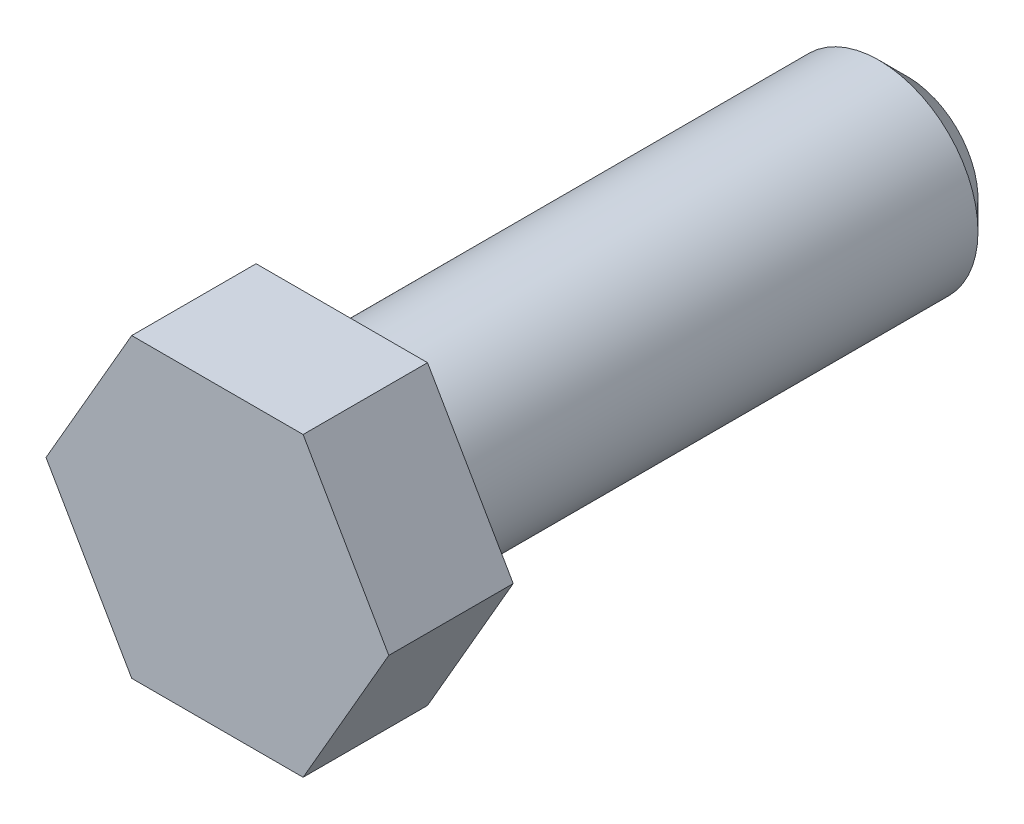
ISO-10303-21;
HEADER;
FILE_DESCRIPTION(('STEP AP214'),'2;1');
FILE_NAME('part.step','',(''),(''),'','','');
FILE_SCHEMA(('AUTOMOTIVE_DESIGN { 1 0 10303 214 1 1 1 1 }'));
ENDSEC;
DATA;
#1=APPLICATION_CONTEXT('core data for automotive mechanical design processes');
#2=APPLICATION_PROTOCOL_DEFINITION('international standard','automotive_design',2000,#1);
#3=PRODUCT_CONTEXT('',#1,'mechanical');
#4=PRODUCT('Part','Part','',(#3));
#5=PRODUCT_RELATED_PRODUCT_CATEGORY('part','',(#4));
#6=PRODUCT_DEFINITION_FORMATION('','',#4);
#7=PRODUCT_DEFINITION_CONTEXT('part definition',#1,'design');
#8=PRODUCT_DEFINITION('design','',#6,#7);
#9=PRODUCT_DEFINITION_SHAPE('','',#8);
#10=(LENGTH_UNIT() NAMED_UNIT(*) SI_UNIT(.MILLI.,.METRE.));
#11=(NAMED_UNIT(*) PLANE_ANGLE_UNIT() SI_UNIT($,.RADIAN.));
#12=(NAMED_UNIT(*) SI_UNIT($,.STERADIAN.) SOLID_ANGLE_UNIT());
#13=UNCERTAINTY_MEASURE_WITH_UNIT(LENGTH_MEASURE(1.E-05),#10,'distance_accuracy_value','');
#14=(GEOMETRIC_REPRESENTATION_CONTEXT(3) GLOBAL_UNCERTAINTY_ASSIGNED_CONTEXT((#13)) GLOBAL_UNIT_ASSIGNED_CONTEXT((#10,
#11,#12)) REPRESENTATION_CONTEXT('',''));
#15=CARTESIAN_POINT('',(0.,0.,0.));
#16=DIRECTION('',(0.,0.,1.));
#17=DIRECTION('',(1.,0.,0.));
#18=AXIS2_PLACEMENT_3D('',#15,#16,#17);
#19=CARTESIAN_POINT('',(-6.06217782649108,10.5,0.));
#20=DIRECTION('',(0.,0.,1.));
#21=DIRECTION('',(1.,0.,0.));
#22=AXIS2_PLACEMENT_3D('',#19,#20,#21);
#23=PLANE('',#22);
#24=DIRECTION('',(-0.499999999999999,-0.866025403784439,0.));
#25=VECTOR('',#24,1.);
#26=CARTESIAN_POINT('',(-6.06217782649108,10.5,0.));
#27=LINE('',#26,#25);
#28=CARTESIAN_POINT('',(-6.06217782649108,10.5,0.));
#29=VERTEX_POINT('',#28);
#30=CARTESIAN_POINT('',(-12.1243556529821,0.,0.));
#31=VERTEX_POINT('',#30);
#32=EDGE_CURVE('E116',#29,#31,#27,.T.);
#33=ORIENTED_EDGE('',*,*,#32,.F.);
#34=DIRECTION('',(1.,0.,0.));
#35=VECTOR('',#34,1.);
#36=CARTESIAN_POINT('',(-6.06217782649108,10.5,0.));
#37=LINE('',#36,#35);
#38=CARTESIAN_POINT('',(6.06217782649106,10.5,0.));
#39=VERTEX_POINT('',#38);
#40=EDGE_CURVE('E126',#29,#39,#37,.T.);
#41=ORIENTED_EDGE('',*,*,#40,.T.);
#42=DIRECTION('',(0.5,-0.866025403784438,0.));
#43=VECTOR('',#42,1.);
#44=CARTESIAN_POINT('',(6.06217782649106,10.5,0.));
#45=LINE('',#44,#43);
#46=CARTESIAN_POINT('',(12.1243556529821,0.,0.));
#47=VERTEX_POINT('',#46);
#48=EDGE_CURVE('E124',#39,#47,#45,.T.);
#49=ORIENTED_EDGE('',*,*,#48,.T.);
#50=DIRECTION('',(-0.499999999999999,-0.866025403784439,0.));
#51=VECTOR('',#50,1.);
#52=CARTESIAN_POINT('',(12.1243556529821,0.,0.));
#53=LINE('',#52,#51);
#54=CARTESIAN_POINT('',(6.06217782649107,-10.5,0.));
#55=VERTEX_POINT('',#54);
#56=EDGE_CURVE('E95',#47,#55,#53,.T.);
#57=ORIENTED_EDGE('',*,*,#56,.T.);
#58=DIRECTION('',(1.,0.,0.));
#59=VECTOR('',#58,1.);
#60=CARTESIAN_POINT('',(-6.06217782649107,-10.5,0.));
#61=LINE('',#60,#59);
#62=CARTESIAN_POINT('',(-6.06217782649107,-10.5,0.));
#63=VERTEX_POINT('',#62);
#64=EDGE_CURVE('E120',#63,#55,#61,.T.);
#65=ORIENTED_EDGE('',*,*,#64,.F.);
#66=DIRECTION('',(0.5,-0.866025403784439,0.));
#67=VECTOR('',#66,1.);
#68=CARTESIAN_POINT('',(-12.1243556529821,0.,0.));
#69=LINE('',#68,#67);
#70=EDGE_CURVE('E118',#31,#63,#69,.T.);
#71=ORIENTED_EDGE('',*,*,#70,.F.);
#72=EDGE_LOOP('',(#33,#41,#49,#57,#65,#71));
#73=FACE_BOUND('',#72,.T.);
#74=CARTESIAN_POINT('',(0.,0.,0.));
#75=DIRECTION('',(0.,0.,1.));
#76=DIRECTION('',(1.,0.,0.));
#77=AXIS2_PLACEMENT_3D('',#74,#75,#76);
#78=CIRCLE('',#77,7.);
#79=CARTESIAN_POINT('',(7.,0.,0.));
#80=VERTEX_POINT('',#79);
#81=EDGE_CURVE('E138',#80,#80,#78,.F.);
#82=ORIENTED_EDGE('',*,*,#81,.F.);
#83=EDGE_LOOP('',(#82));
#84=FACE_BOUND('',#83,.T.);
#85=ADVANCED_FACE('F30',(#73,#84),#23,.F.);
#86=CARTESIAN_POINT('',(-6.06217782649108,10.5,8.8));
#87=DIRECTION('',(0.866025403784439,-0.499999999999999,0.));
#88=DIRECTION('',(0.499999999999999,0.866025403784439,0.));
#89=AXIS2_PLACEMENT_3D('',#86,#87,#88);
#90=PLANE('',#89);
#91=ORIENTED_EDGE('',*,*,#32,.T.);
#92=DIRECTION('',(0.,0.,-1.));
#93=VECTOR('',#92,1.);
#94=CARTESIAN_POINT('',(-12.1243556529821,0.,8.8));
#95=LINE('',#94,#93);
#96=CARTESIAN_POINT('',(-12.1243556529821,0.,8.8));
#97=VERTEX_POINT('',#96);
#98=EDGE_CURVE('E136',#97,#31,#95,.T.);
#99=ORIENTED_EDGE('',*,*,#98,.F.);
#100=DIRECTION('',(-0.499999999999999,-0.866025403784439,0.));
#101=VECTOR('',#100,1.);
#102=CARTESIAN_POINT('',(-6.06217782649108,10.5,8.8));
#103=LINE('',#102,#101);
#104=CARTESIAN_POINT('',(-6.06217782649108,10.5,8.8));
#105=VERTEX_POINT('',#104);
#106=EDGE_CURVE('E129',#105,#97,#103,.T.);
#107=ORIENTED_EDGE('',*,*,#106,.F.);
#108=DIRECTION('',(0.,0.,-1.));
#109=VECTOR('',#108,1.);
#110=CARTESIAN_POINT('',(-6.06217782649108,10.5,8.8));
#111=LINE('',#110,#109);
#112=EDGE_CURVE('E47',#105,#29,#111,.T.);
#113=ORIENTED_EDGE('',*,*,#112,.T.);
#114=EDGE_LOOP('',(#91,#99,#107,#113));
#115=FACE_BOUND('',#114,.T.);
#116=ADVANCED_FACE('F154',(#115),#90,.F.);
#117=CARTESIAN_POINT('',(-12.1243556529821,0.,8.8));
#118=DIRECTION('',(0.866025403784439,0.5,0.));
#119=DIRECTION('',(-0.5,0.866025403784439,0.));
#120=AXIS2_PLACEMENT_3D('',#117,#118,#119);
#121=PLANE('',#120);
#122=ORIENTED_EDGE('',*,*,#70,.T.);
#123=DIRECTION('',(0.,0.,-1.));
#124=VECTOR('',#123,1.);
#125=CARTESIAN_POINT('',(-6.06217782649107,-10.5,8.8));
#126=LINE('',#125,#124);
#127=CARTESIAN_POINT('',(-6.06217782649107,-10.5,8.8));
#128=VERTEX_POINT('',#127);
#129=EDGE_CURVE('E133',#128,#63,#126,.T.);
#130=ORIENTED_EDGE('',*,*,#129,.F.);
#131=DIRECTION('',(0.5,-0.866025403784439,0.));
#132=VECTOR('',#131,1.);
#133=CARTESIAN_POINT('',(-12.1243556529821,0.,8.8));
#134=LINE('',#133,#132);
#135=EDGE_CURVE('E80',#97,#128,#134,.T.);
#136=ORIENTED_EDGE('',*,*,#135,.F.);
#137=ORIENTED_EDGE('',*,*,#98,.T.);
#138=EDGE_LOOP('',(#122,#130,#136,#137));
#139=FACE_BOUND('',#138,.T.);
#140=ADVANCED_FACE('F160',(#139),#121,.F.);
#141=CARTESIAN_POINT('',(-6.06217782649107,-10.5,8.8));
#142=DIRECTION('',(0.,1.,0.));
#143=DIRECTION('',(0.,0.,1.));
#144=AXIS2_PLACEMENT_3D('',#141,#142,#143);
#145=PLANE('',#144);
#146=ORIENTED_EDGE('',*,*,#64,.T.);
#147=DIRECTION('',(0.,0.,-1.));
#148=VECTOR('',#147,1.);
#149=CARTESIAN_POINT('',(6.06217782649107,-10.5,8.8));
#150=LINE('',#149,#148);
#151=CARTESIAN_POINT('',(6.06217782649107,-10.5,8.8));
#152=VERTEX_POINT('',#151);
#153=EDGE_CURVE('E99',#152,#55,#150,.T.);
#154=ORIENTED_EDGE('',*,*,#153,.F.);
#155=DIRECTION('',(1.,0.,0.));
#156=VECTOR('',#155,1.);
#157=CARTESIAN_POINT('',(-6.06217782649107,-10.5,8.8));
#158=LINE('',#157,#156);
#159=EDGE_CURVE('E107',#128,#152,#158,.T.);
#160=ORIENTED_EDGE('',*,*,#159,.F.);
#161=ORIENTED_EDGE('',*,*,#129,.T.);
#162=EDGE_LOOP('',(#146,#154,#160,#161));
#163=FACE_BOUND('',#162,.T.);
#164=ADVANCED_FACE('F172',(#163),#145,.F.);
#165=CARTESIAN_POINT('',(12.1243556529821,0.,8.8));
#166=DIRECTION('',(0.866025403784439,-0.5,0.));
#167=DIRECTION('',(0.5,0.866025403784439,0.));
#168=AXIS2_PLACEMENT_3D('',#165,#166,#167);
#169=PLANE('',#168);
#170=ORIENTED_EDGE('',*,*,#56,.F.);
#171=DIRECTION('',(0.,0.,-1.));
#172=VECTOR('',#171,1.);
#173=CARTESIAN_POINT('',(12.1243556529821,0.,8.8));
#174=LINE('',#173,#172);
#175=CARTESIAN_POINT('',(12.1243556529821,0.,8.8));
#176=VERTEX_POINT('',#175);
#177=EDGE_CURVE('E90',#176,#47,#174,.T.);
#178=ORIENTED_EDGE('',*,*,#177,.F.);
#179=DIRECTION('',(-0.499999999999999,-0.866025403784439,0.));
#180=VECTOR('',#179,1.);
#181=CARTESIAN_POINT('',(12.1243556529821,0.,8.8));
#182=LINE('',#181,#180);
#183=EDGE_CURVE('E93',#176,#152,#182,.T.);
#184=ORIENTED_EDGE('',*,*,#183,.T.);
#185=ORIENTED_EDGE('',*,*,#153,.T.);
#186=EDGE_LOOP('',(#170,#178,#184,#185));
#187=FACE_BOUND('',#186,.T.);
#188=ADVANCED_FACE('F92',(#187),#169,.T.);
#189=CARTESIAN_POINT('',(6.06217782649106,10.5,8.8));
#190=DIRECTION('',(0.866025403784438,0.5,0.));
#191=DIRECTION('',(-0.5,0.866025403784438,0.));
#192=AXIS2_PLACEMENT_3D('',#189,#190,#191);
#193=PLANE('',#192);
#194=ORIENTED_EDGE('',*,*,#48,.F.);
#195=DIRECTION('',(0.,0.,-1.));
#196=VECTOR('',#195,1.);
#197=CARTESIAN_POINT('',(6.06217782649106,10.5,8.8));
#198=LINE('',#197,#196);
#199=CARTESIAN_POINT('',(6.06217782649106,10.5,8.8));
#200=VERTEX_POINT('',#199);
#201=EDGE_CURVE('E67',#200,#39,#198,.T.);
#202=ORIENTED_EDGE('',*,*,#201,.F.);
#203=DIRECTION('',(0.5,-0.866025403784438,0.));
#204=VECTOR('',#203,1.);
#205=CARTESIAN_POINT('',(6.06217782649106,10.5,8.8));
#206=LINE('',#205,#204);
#207=EDGE_CURVE('E105',#200,#176,#206,.T.);
#208=ORIENTED_EDGE('',*,*,#207,.T.);
#209=ORIENTED_EDGE('',*,*,#177,.T.);
#210=EDGE_LOOP('',(#194,#202,#208,#209));
#211=FACE_BOUND('',#210,.T.);
#212=ADVANCED_FACE('F110',(#211),#193,.T.);
#213=CARTESIAN_POINT('',(-6.06217782649108,10.5,8.8));
#214=DIRECTION('',(0.,1.,0.));
#215=DIRECTION('',(0.,0.,1.));
#216=AXIS2_PLACEMENT_3D('',#213,#214,#215);
#217=PLANE('',#216);
#218=ORIENTED_EDGE('',*,*,#40,.F.);
#219=ORIENTED_EDGE('',*,*,#112,.F.);
#220=DIRECTION('',(1.,0.,0.));
#221=VECTOR('',#220,1.);
#222=CARTESIAN_POINT('',(-6.06217782649108,10.5,8.8));
#223=LINE('',#222,#221);
#224=EDGE_CURVE('E111',#105,#200,#223,.T.);
#225=ORIENTED_EDGE('',*,*,#224,.T.);
#226=ORIENTED_EDGE('',*,*,#201,.T.);
#227=EDGE_LOOP('',(#218,#219,#225,#226));
#228=FACE_BOUND('',#227,.T.);
#229=ADVANCED_FACE('F165',(#228),#217,.T.);
#230=CARTESIAN_POINT('',(-6.06217782649108,10.5,8.8));
#231=DIRECTION('',(0.,0.,1.));
#232=DIRECTION('',(1.,0.,0.));
#233=AXIS2_PLACEMENT_3D('',#230,#231,#232);
#234=PLANE('',#233);
#235=ORIENTED_EDGE('',*,*,#106,.T.);
#236=ORIENTED_EDGE('',*,*,#135,.T.);
#237=ORIENTED_EDGE('',*,*,#159,.T.);
#238=ORIENTED_EDGE('',*,*,#183,.F.);
#239=ORIENTED_EDGE('',*,*,#207,.F.);
#240=ORIENTED_EDGE('',*,*,#224,.F.);
#241=EDGE_LOOP('',(#235,#236,#237,#238,#239,#240));
#242=FACE_BOUND('',#241,.T.);
#243=ADVANCED_FACE('F103',(#242),#234,.T.);
#244=CARTESIAN_POINT('',(0.,0.,-40.));
#245=DIRECTION('',(0.,0.,1.));
#246=DIRECTION('',(1.,0.,0.));
#247=AXIS2_PLACEMENT_3D('',#244,#245,#246);
#248=CYLINDRICAL_SURFACE('',#247,7.);
#249=CARTESIAN_POINT('',(0.,0.,-38.));
#250=DIRECTION('',(0.,0.,-1.));
#251=DIRECTION('',(-1.,0.,0.));
#252=AXIS2_PLACEMENT_3D('',#249,#250,#251);
#253=CIRCLE('',#252,7.);
#254=CARTESIAN_POINT('',(-7.,0.,-38.));
#255=VERTEX_POINT('',#254);
#256=EDGE_CURVE('E11',#255,#255,#253,.F.);
#257=ORIENTED_EDGE('',*,*,#256,.T.);
#258=EDGE_LOOP('',(#257));
#259=FACE_BOUND('',#258,.T.);
#260=ORIENTED_EDGE('',*,*,#81,.T.);
#261=EDGE_LOOP('',(#260));
#262=FACE_BOUND('',#261,.T.);
#263=ADVANCED_FACE('F150',(#259,#262),#248,.T.);
#264=CARTESIAN_POINT('',(0.,0.,-40.));
#265=DIRECTION('',(0.,0.,-1.));
#266=DIRECTION('',(-1.,0.,0.));
#267=AXIS2_PLACEMENT_3D('',#264,#265,#266);
#268=PLANE('',#267);
#269=CARTESIAN_POINT('',(0.,0.,-40.));
#270=DIRECTION('',(0.,0.,-1.));
#271=DIRECTION('',(-1.,0.,0.));
#272=AXIS2_PLACEMENT_3D('',#269,#270,#271);
#273=CIRCLE('',#272,4.99999999999996);
#274=CARTESIAN_POINT('',(-4.99999999999996,0.,-40.));
#275=VERTEX_POINT('',#274);
#276=EDGE_CURVE('E39',#275,#275,#273,.T.);
#277=ORIENTED_EDGE('',*,*,#276,.T.);
#278=EDGE_LOOP('',(#277));
#279=FACE_BOUND('',#278,.T.);
#280=ADVANCED_FACE('F143',(#279),#268,.T.);
#281=CARTESIAN_POINT('',(0.,0.,-40.));
#282=DIRECTION('',(0.,0.,1.));
#283=DIRECTION('',(1.,0.,0.));
#284=AXIS2_PLACEMENT_3D('',#281,#282,#283);
#285=CONICAL_SURFACE('',#284,4.99999999999996,0.785398163397453);
#286=ORIENTED_EDGE('',*,*,#256,.F.);
#287=EDGE_LOOP('',(#286));
#288=FACE_BOUND('',#287,.T.);
#289=ORIENTED_EDGE('',*,*,#276,.F.);
#290=EDGE_LOOP('',(#289));
#291=FACE_BOUND('',#290,.T.);
#292=ADVANCED_FACE('F32',(#288,#291),#285,.T.);
#293=CLOSED_SHELL('',(#85,#116,#140,#164,#188,#212,#229,#243,#263,#280,#292));
#294=MANIFOLD_SOLID_BREP('B2',#293);
#295=ADVANCED_BREP_SHAPE_REPRESENTATION('',(#18,#294),#14);
#296=SHAPE_DEFINITION_REPRESENTATION(#9,#295);
ENDSEC;
END-ISO-10303-21;
